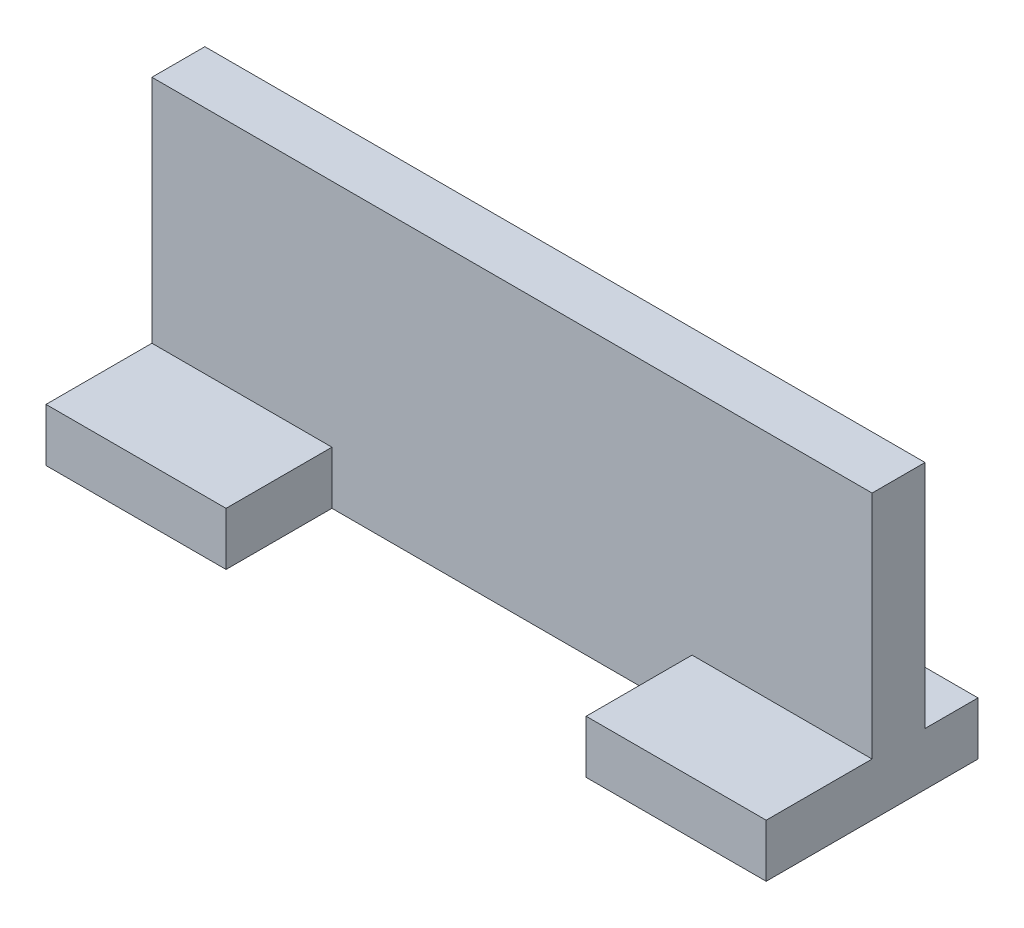
ISO-10303-21;
HEADER;
FILE_DESCRIPTION(('STEP AP214'),'2;1');
FILE_NAME('part.step','',(''),(''),'','','');
FILE_SCHEMA(('AUTOMOTIVE_DESIGN { 1 0 10303 214 1 1 1 1 }'));
ENDSEC;
DATA;
#1=APPLICATION_CONTEXT('core data for automotive mechanical design processes');
#2=APPLICATION_PROTOCOL_DEFINITION('international standard','automotive_design',2000,#1);
#3=PRODUCT_CONTEXT('',#1,'mechanical');
#4=PRODUCT('Part','Part','',(#3));
#5=PRODUCT_RELATED_PRODUCT_CATEGORY('part','',(#4));
#6=PRODUCT_DEFINITION_FORMATION('','',#4);
#7=PRODUCT_DEFINITION_CONTEXT('part definition',#1,'design');
#8=PRODUCT_DEFINITION('design','',#6,#7);
#9=PRODUCT_DEFINITION_SHAPE('','',#8);
#10=(LENGTH_UNIT() NAMED_UNIT(*) SI_UNIT(.MILLI.,.METRE.));
#11=(NAMED_UNIT(*) PLANE_ANGLE_UNIT() SI_UNIT($,.RADIAN.));
#12=(NAMED_UNIT(*) SI_UNIT($,.STERADIAN.) SOLID_ANGLE_UNIT());
#13=UNCERTAINTY_MEASURE_WITH_UNIT(LENGTH_MEASURE(1.E-05),#10,'distance_accuracy_value','');
#14=(GEOMETRIC_REPRESENTATION_CONTEXT(3) GLOBAL_UNCERTAINTY_ASSIGNED_CONTEXT((#13)) GLOBAL_UNIT_ASSIGNED_CONTEXT((#10,
#11,#12)) REPRESENTATION_CONTEXT('',''));
#15=CARTESIAN_POINT('',(0.,0.,0.));
#16=DIRECTION('',(0.,0.,1.));
#17=DIRECTION('',(1.,0.,0.));
#18=AXIS2_PLACEMENT_3D('',#15,#16,#17);
#19=CARTESIAN_POINT('',(0.,0.,10.));
#20=DIRECTION('',(0.,0.,1.));
#21=DIRECTION('',(1.,0.,0.));
#22=AXIS2_PLACEMENT_3D('',#19,#20,#21);
#23=PLANE('',#22);
#24=DIRECTION('',(0.,-1.,0.));
#25=VECTOR('',#24,1.);
#26=CARTESIAN_POINT('',(34.,-26.75,10.));
#27=LINE('',#26,#25);
#28=CARTESIAN_POINT('',(34.,-16.75,10.));
#29=VERTEX_POINT('',#28);
#30=CARTESIAN_POINT('',(34.,-26.75,10.));
#31=VERTEX_POINT('',#30);
#32=EDGE_CURVE('E61',#29,#31,#27,.T.);
#33=ORIENTED_EDGE('',*,*,#32,.F.);
#34=DIRECTION('',(1.,0.,0.));
#35=VECTOR('',#34,1.);
#36=CARTESIAN_POINT('',(34.,-16.75,10.));
#37=LINE('',#36,#35);
#38=CARTESIAN_POINT('',(68.,-16.75,10.));
#39=VERTEX_POINT('',#38);
#40=EDGE_CURVE('E181',#29,#39,#37,.T.);
#41=ORIENTED_EDGE('',*,*,#40,.T.);
#42=DIRECTION('',(0.,1.,0.));
#43=VECTOR('',#42,1.);
#44=CARTESIAN_POINT('',(68.,26.75,10.));
#45=LINE('',#44,#43);
#46=CARTESIAN_POINT('',(68.,26.75,10.));
#47=VERTEX_POINT('',#46);
#48=EDGE_CURVE('E308',#39,#47,#45,.T.);
#49=ORIENTED_EDGE('',*,*,#48,.T.);
#50=DIRECTION('',(-1.,0.,0.));
#51=VECTOR('',#50,1.);
#52=CARTESIAN_POINT('',(-68.,26.75,10.));
#53=LINE('',#52,#51);
#54=CARTESIAN_POINT('',(-68.,26.75,10.));
#55=VERTEX_POINT('',#54);
#56=EDGE_CURVE('E311',#47,#55,#53,.T.);
#57=ORIENTED_EDGE('',*,*,#56,.T.);
#58=DIRECTION('',(0.,-1.,0.));
#59=VECTOR('',#58,1.);
#60=CARTESIAN_POINT('',(-68.,26.75,10.));
#61=LINE('',#60,#59);
#62=CARTESIAN_POINT('',(-68.,-16.75,10.));
#63=VERTEX_POINT('',#62);
#64=EDGE_CURVE('E315',#55,#63,#61,.T.);
#65=ORIENTED_EDGE('',*,*,#64,.T.);
#66=DIRECTION('',(-1.,0.,0.));
#67=VECTOR('',#66,1.);
#68=CARTESIAN_POINT('',(-34.,-16.75,10.));
#69=LINE('',#68,#67);
#70=CARTESIAN_POINT('',(-34.,-16.75,10.));
#71=VERTEX_POINT('',#70);
#72=EDGE_CURVE('E224',#71,#63,#69,.T.);
#73=ORIENTED_EDGE('',*,*,#72,.F.);
#74=DIRECTION('',(0.,-1.,0.));
#75=VECTOR('',#74,1.);
#76=CARTESIAN_POINT('',(-34.,-26.75,10.));
#77=LINE('',#76,#75);
#78=CARTESIAN_POINT('',(-34.,-26.75,10.));
#79=VERTEX_POINT('',#78);
#80=EDGE_CURVE('E247',#71,#79,#77,.T.);
#81=ORIENTED_EDGE('',*,*,#80,.T.);
#82=DIRECTION('',(1.,0.,0.));
#83=VECTOR('',#82,1.);
#84=CARTESIAN_POINT('',(-68.,-26.75,10.));
#85=LINE('',#84,#83);
#86=EDGE_CURVE('E66',#79,#31,#85,.T.);
#87=ORIENTED_EDGE('',*,*,#86,.T.);
#88=EDGE_LOOP('',(#33,#41,#49,#57,#65,#73,#81,#87));
#89=FACE_BOUND('',#88,.T.);
#90=ADVANCED_FACE('F45',(#89),#23,.T.);
#91=CARTESIAN_POINT('',(0.,0.,0.));
#92=DIRECTION('',(0.,0.,1.));
#93=DIRECTION('',(1.,0.,0.));
#94=AXIS2_PLACEMENT_3D('',#91,#92,#93);
#95=PLANE('',#94);
#96=CARTESIAN_POINT('',(-12.5,9.25000000000001,0.));
#97=DIRECTION('',(0.,0.,1.));
#98=DIRECTION('',(1.,0.,0.));
#99=AXIS2_PLACEMENT_3D('',#96,#97,#98);
#100=CIRCLE('',#99,5.);
#101=CARTESIAN_POINT('',(-7.50000000000002,9.25000000000001,0.));
#102=VERTEX_POINT('',#101);
#103=EDGE_CURVE('E54',#102,#102,#100,.F.);
#104=ORIENTED_EDGE('',*,*,#103,.F.);
#105=EDGE_LOOP('',(#104));
#106=FACE_BOUND('',#105,.T.);
#107=CARTESIAN_POINT('',(12.5,9.24999999999983,0.));
#108=DIRECTION('',(0.,0.,1.));
#109=DIRECTION('',(1.,0.,0.));
#110=AXIS2_PLACEMENT_3D('',#107,#108,#109);
#111=CIRCLE('',#110,5.);
#112=CARTESIAN_POINT('',(17.5,9.24999999999983,0.));
#113=VERTEX_POINT('',#112);
#114=EDGE_CURVE('E11',#113,#113,#111,.F.);
#115=ORIENTED_EDGE('',*,*,#114,.F.);
#116=EDGE_LOOP('',(#115));
#117=FACE_BOUND('',#116,.T.);
#118=DIRECTION('',(1.,0.,0.));
#119=VECTOR('',#118,1.);
#120=CARTESIAN_POINT('',(34.,-16.75,0.));
#121=LINE('',#120,#119);
#122=CARTESIAN_POINT('',(34.,-16.75,0.));
#123=VERTEX_POINT('',#122);
#124=CARTESIAN_POINT('',(68.,-16.75,0.));
#125=VERTEX_POINT('',#124);
#126=EDGE_CURVE('E221',#123,#125,#121,.T.);
#127=ORIENTED_EDGE('',*,*,#126,.F.);
#128=DIRECTION('',(0.,1.,0.));
#129=VECTOR('',#128,1.);
#130=CARTESIAN_POINT('',(34.,-26.75,0.));
#131=LINE('',#130,#129);
#132=CARTESIAN_POINT('',(34.,-26.75,0.));
#133=VERTEX_POINT('',#132);
#134=EDGE_CURVE('E201',#133,#123,#131,.T.);
#135=ORIENTED_EDGE('',*,*,#134,.F.);
#136=DIRECTION('',(1.,0.,0.));
#137=VECTOR('',#136,1.);
#138=CARTESIAN_POINT('',(-68.,-26.75,0.));
#139=LINE('',#138,#137);
#140=CARTESIAN_POINT('',(-34.,-26.75,0.));
#141=VERTEX_POINT('',#140);
#142=EDGE_CURVE('E312',#141,#133,#139,.T.);
#143=ORIENTED_EDGE('',*,*,#142,.F.);
#144=DIRECTION('',(0.,1.,0.));
#145=VECTOR('',#144,1.);
#146=CARTESIAN_POINT('',(-34.,-26.75,0.));
#147=LINE('',#146,#145);
#148=CARTESIAN_POINT('',(-34.,-16.75,0.));
#149=VERTEX_POINT('',#148);
#150=EDGE_CURVE('E265',#141,#149,#147,.T.);
#151=ORIENTED_EDGE('',*,*,#150,.T.);
#152=DIRECTION('',(-1.,0.,0.));
#153=VECTOR('',#152,1.);
#154=CARTESIAN_POINT('',(-34.,-16.75,0.));
#155=LINE('',#154,#153);
#156=CARTESIAN_POINT('',(-68.,-16.75,0.));
#157=VERTEX_POINT('',#156);
#158=EDGE_CURVE('E282',#149,#157,#155,.T.);
#159=ORIENTED_EDGE('',*,*,#158,.T.);
#160=DIRECTION('',(0.,-1.,0.));
#161=VECTOR('',#160,1.);
#162=CARTESIAN_POINT('',(-68.,26.75,0.));
#163=LINE('',#162,#161);
#164=CARTESIAN_POINT('',(-68.,26.75,0.));
#165=VERTEX_POINT('',#164);
#166=EDGE_CURVE('E327',#165,#157,#163,.T.);
#167=ORIENTED_EDGE('',*,*,#166,.F.);
#168=DIRECTION('',(-1.,0.,0.));
#169=VECTOR('',#168,1.);
#170=CARTESIAN_POINT('',(-68.,26.75,0.));
#171=LINE('',#170,#169);
#172=CARTESIAN_POINT('',(68.,26.75,0.));
#173=VERTEX_POINT('',#172);
#174=EDGE_CURVE('E324',#173,#165,#171,.T.);
#175=ORIENTED_EDGE('',*,*,#174,.F.);
#176=DIRECTION('',(0.,1.,0.));
#177=VECTOR('',#176,1.);
#178=CARTESIAN_POINT('',(68.,26.75,0.));
#179=LINE('',#178,#177);
#180=EDGE_CURVE('E307',#125,#173,#179,.T.);
#181=ORIENTED_EDGE('',*,*,#180,.F.);
#182=EDGE_LOOP('',(#127,#135,#143,#151,#159,#167,#175,#181));
#183=FACE_BOUND('',#182,.T.);
#184=ADVANCED_FACE('F352',(#106,#117,#183),#95,.F.);
#185=CARTESIAN_POINT('',(68.,26.75,10.));
#186=DIRECTION('',(-1.,0.,0.));
#187=DIRECTION('',(0.,0.,1.));
#188=AXIS2_PLACEMENT_3D('',#185,#186,#187);
#189=PLANE('',#188);
#190=DIRECTION('',(0.,0.,-1.));
#191=VECTOR('',#190,1.);
#192=CARTESIAN_POINT('',(68.,-26.75,10.));
#193=LINE('',#192,#191);
#194=CARTESIAN_POINT('',(68.,-26.75,30.));
#195=VERTEX_POINT('',#194);
#196=CARTESIAN_POINT('',(68.,-26.75,-10.));
#197=VERTEX_POINT('',#196);
#198=EDGE_CURVE('E321',#195,#197,#193,.T.);
#199=ORIENTED_EDGE('',*,*,#198,.T.);
#200=DIRECTION('',(0.,-1.,0.));
#201=VECTOR('',#200,1.);
#202=CARTESIAN_POINT('',(68.,-26.75,-10.));
#203=LINE('',#202,#201);
#204=CARTESIAN_POINT('',(68.,-16.75,-10.));
#205=VERTEX_POINT('',#204);
#206=EDGE_CURVE('E197',#205,#197,#203,.T.);
#207=ORIENTED_EDGE('',*,*,#206,.F.);
#208=DIRECTION('',(0.,0.,-1.));
#209=VECTOR('',#208,1.);
#210=CARTESIAN_POINT('',(68.,-16.75,0.));
#211=LINE('',#210,#209);
#212=EDGE_CURVE('E206',#125,#205,#211,.T.);
#213=ORIENTED_EDGE('',*,*,#212,.F.);
#214=ORIENTED_EDGE('',*,*,#180,.T.);
#215=DIRECTION('',(0.,0.,-1.));
#216=VECTOR('',#215,1.);
#217=CARTESIAN_POINT('',(68.,26.75,10.));
#218=LINE('',#217,#216);
#219=EDGE_CURVE('E343',#47,#173,#218,.T.);
#220=ORIENTED_EDGE('',*,*,#219,.F.);
#221=ORIENTED_EDGE('',*,*,#48,.F.);
#222=DIRECTION('',(0.,0.,-1.));
#223=VECTOR('',#222,1.);
#224=CARTESIAN_POINT('',(68.,-16.75,10.));
#225=LINE('',#224,#223);
#226=CARTESIAN_POINT('',(68.,-16.75,30.));
#227=VERTEX_POINT('',#226);
#228=EDGE_CURVE('E191',#227,#39,#225,.T.);
#229=ORIENTED_EDGE('',*,*,#228,.F.);
#230=DIRECTION('',(0.,1.,0.));
#231=VECTOR('',#230,1.);
#232=CARTESIAN_POINT('',(68.,-26.75,30.));
#233=LINE('',#232,#231);
#234=EDGE_CURVE('E175',#195,#227,#233,.T.);
#235=ORIENTED_EDGE('',*,*,#234,.F.);
#236=EDGE_LOOP('',(#199,#207,#213,#214,#220,#221,#229,#235));
#237=FACE_BOUND('',#236,.T.);
#238=ADVANCED_FACE('F47',(#237),#189,.F.);
#239=CARTESIAN_POINT('',(-68.,26.75,10.));
#240=DIRECTION('',(0.,-1.,0.));
#241=DIRECTION('',(0.,0.,-1.));
#242=AXIS2_PLACEMENT_3D('',#239,#240,#241);
#243=PLANE('',#242);
#244=ORIENTED_EDGE('',*,*,#174,.T.);
#245=DIRECTION('',(0.,0.,-1.));
#246=VECTOR('',#245,1.);
#247=CARTESIAN_POINT('',(-68.,26.75,10.));
#248=LINE('',#247,#246);
#249=EDGE_CURVE('E339',#55,#165,#248,.T.);
#250=ORIENTED_EDGE('',*,*,#249,.F.);
#251=ORIENTED_EDGE('',*,*,#56,.F.);
#252=ORIENTED_EDGE('',*,*,#219,.T.);
#253=EDGE_LOOP('',(#244,#250,#251,#252));
#254=FACE_BOUND('',#253,.T.);
#255=ADVANCED_FACE('F401',(#254),#243,.F.);
#256=CARTESIAN_POINT('',(-68.,26.75,10.));
#257=DIRECTION('',(1.,0.,0.));
#258=DIRECTION('',(0.,1.,0.));
#259=AXIS2_PLACEMENT_3D('',#256,#257,#258);
#260=PLANE('',#259);
#261=ORIENTED_EDGE('',*,*,#166,.T.);
#262=DIRECTION('',(0.,0.,-1.));
#263=VECTOR('',#262,1.);
#264=CARTESIAN_POINT('',(-68.,-16.75,0.));
#265=LINE('',#264,#263);
#266=CARTESIAN_POINT('',(-68.,-16.75,-10.));
#267=VERTEX_POINT('',#266);
#268=EDGE_CURVE('E251',#157,#267,#265,.T.);
#269=ORIENTED_EDGE('',*,*,#268,.T.);
#270=DIRECTION('',(0.,-1.,0.));
#271=VECTOR('',#270,1.);
#272=CARTESIAN_POINT('',(-68.,-26.75,-10.));
#273=LINE('',#272,#271);
#274=CARTESIAN_POINT('',(-68.,-26.75,-10.));
#275=VERTEX_POINT('',#274);
#276=EDGE_CURVE('E270',#267,#275,#273,.T.);
#277=ORIENTED_EDGE('',*,*,#276,.T.);
#278=DIRECTION('',(0.,0.,-1.));
#279=VECTOR('',#278,1.);
#280=CARTESIAN_POINT('',(-68.,-26.75,10.));
#281=LINE('',#280,#279);
#282=CARTESIAN_POINT('',(-68.,-26.75,30.));
#283=VERTEX_POINT('',#282);
#284=EDGE_CURVE('E336',#283,#275,#281,.T.);
#285=ORIENTED_EDGE('',*,*,#284,.F.);
#286=DIRECTION('',(0.,1.,0.));
#287=VECTOR('',#286,1.);
#288=CARTESIAN_POINT('',(-68.,-26.75,30.));
#289=LINE('',#288,#287);
#290=CARTESIAN_POINT('',(-68.,-16.75,30.));
#291=VERTEX_POINT('',#290);
#292=EDGE_CURVE('E246',#283,#291,#289,.T.);
#293=ORIENTED_EDGE('',*,*,#292,.T.);
#294=DIRECTION('',(0.,0.,-1.));
#295=VECTOR('',#294,1.);
#296=CARTESIAN_POINT('',(-68.,-16.75,10.));
#297=LINE('',#296,#295);
#298=EDGE_CURVE('E242',#291,#63,#297,.T.);
#299=ORIENTED_EDGE('',*,*,#298,.T.);
#300=ORIENTED_EDGE('',*,*,#64,.F.);
#301=ORIENTED_EDGE('',*,*,#249,.T.);
#302=EDGE_LOOP('',(#261,#269,#277,#285,#293,#299,#300,#301));
#303=FACE_BOUND('',#302,.T.);
#304=ADVANCED_FACE('F399',(#303),#260,.F.);
#305=CARTESIAN_POINT('',(-68.,-26.75,10.));
#306=DIRECTION('',(0.,1.,0.));
#307=DIRECTION('',(0.,0.,1.));
#308=AXIS2_PLACEMENT_3D('',#305,#306,#307);
#309=PLANE('',#308);
#310=ORIENTED_EDGE('',*,*,#284,.T.);
#311=DIRECTION('',(-1.,0.,0.));
#312=VECTOR('',#311,1.);
#313=CARTESIAN_POINT('',(-34.,-26.75,-10.));
#314=LINE('',#313,#312);
#315=CARTESIAN_POINT('',(-34.,-26.75,-10.));
#316=VERTEX_POINT('',#315);
#317=EDGE_CURVE('E289',#316,#275,#314,.T.);
#318=ORIENTED_EDGE('',*,*,#317,.F.);
#319=DIRECTION('',(0.,0.,1.));
#320=VECTOR('',#319,1.);
#321=CARTESIAN_POINT('',(-34.,-26.75,0.));
#322=LINE('',#321,#320);
#323=EDGE_CURVE('E278',#316,#141,#322,.T.);
#324=ORIENTED_EDGE('',*,*,#323,.T.);
#325=ORIENTED_EDGE('',*,*,#142,.T.);
#326=DIRECTION('',(0.,0.,1.));
#327=VECTOR('',#326,1.);
#328=CARTESIAN_POINT('',(34.,-26.75,0.));
#329=LINE('',#328,#327);
#330=CARTESIAN_POINT('',(34.,-26.75,-10.));
#331=VERTEX_POINT('',#330);
#332=EDGE_CURVE('E205',#331,#133,#329,.T.);
#333=ORIENTED_EDGE('',*,*,#332,.F.);
#334=DIRECTION('',(1.,0.,0.));
#335=VECTOR('',#334,1.);
#336=CARTESIAN_POINT('',(34.,-26.75,-10.));
#337=LINE('',#336,#335);
#338=EDGE_CURVE('E215',#331,#197,#337,.T.);
#339=ORIENTED_EDGE('',*,*,#338,.T.);
#340=ORIENTED_EDGE('',*,*,#198,.F.);
#341=DIRECTION('',(1.,0.,0.));
#342=VECTOR('',#341,1.);
#343=CARTESIAN_POINT('',(34.,-26.75,30.));
#344=LINE('',#343,#342);
#345=CARTESIAN_POINT('',(34.,-26.75,30.));
#346=VERTEX_POINT('',#345);
#347=EDGE_CURVE('E180',#346,#195,#344,.T.);
#348=ORIENTED_EDGE('',*,*,#347,.F.);
#349=DIRECTION('',(0.,0.,1.));
#350=VECTOR('',#349,1.);
#351=CARTESIAN_POINT('',(34.,-26.75,10.));
#352=LINE('',#351,#350);
#353=EDGE_CURVE('E165',#31,#346,#352,.T.);
#354=ORIENTED_EDGE('',*,*,#353,.F.);
#355=ORIENTED_EDGE('',*,*,#86,.F.);
#356=DIRECTION('',(0.,0.,1.));
#357=VECTOR('',#356,1.);
#358=CARTESIAN_POINT('',(-34.,-26.75,10.));
#359=LINE('',#358,#357);
#360=CARTESIAN_POINT('',(-34.,-26.75,30.));
#361=VERTEX_POINT('',#360);
#362=EDGE_CURVE('E259',#79,#361,#359,.T.);
#363=ORIENTED_EDGE('',*,*,#362,.T.);
#364=DIRECTION('',(-1.,0.,0.));
#365=VECTOR('',#364,1.);
#366=CARTESIAN_POINT('',(-34.,-26.75,30.));
#367=LINE('',#366,#365);
#368=EDGE_CURVE('E232',#361,#283,#367,.T.);
#369=ORIENTED_EDGE('',*,*,#368,.T.);
#370=EDGE_LOOP('',(#310,#318,#324,#325,#333,#339,#340,#348,#354,#355,#363,#369));
#371=FACE_BOUND('',#370,.T.);
#372=ADVANCED_FACE('F376',(#371),#309,.F.);
#373=CARTESIAN_POINT('',(-12.5,9.25000000000001,-12.));
#374=DIRECTION('',(0.,0.,1.));
#375=DIRECTION('',(1.,0.,0.));
#376=AXIS2_PLACEMENT_3D('',#373,#374,#375);
#377=CYLINDRICAL_SURFACE('',#376,5.);
#378=CARTESIAN_POINT('',(-12.5,9.25000000000001,-12.));
#379=DIRECTION('',(0.,0.,-1.));
#380=DIRECTION('',(-1.,0.,0.));
#381=AXIS2_PLACEMENT_3D('',#378,#379,#380);
#382=CIRCLE('',#381,5.);
#383=CARTESIAN_POINT('',(-17.5,9.25000000000001,-12.));
#384=VERTEX_POINT('',#383);
#385=EDGE_CURVE('E303',#384,#384,#382,.T.);
#386=ORIENTED_EDGE('',*,*,#385,.F.);
#387=EDGE_LOOP('',(#386));
#388=FACE_BOUND('',#387,.T.);
#389=ORIENTED_EDGE('',*,*,#103,.T.);
#390=EDGE_LOOP('',(#389));
#391=FACE_BOUND('',#390,.T.);
#392=ADVANCED_FACE('F350',(#388,#391),#377,.T.);
#393=CARTESIAN_POINT('',(-12.5,9.25000000000001,-12.));
#394=DIRECTION('',(0.,0.,-1.));
#395=DIRECTION('',(-1.,0.,0.));
#396=AXIS2_PLACEMENT_3D('',#393,#394,#395);
#397=PLANE('',#396);
#398=ORIENTED_EDGE('',*,*,#385,.T.);
#399=EDGE_LOOP('',(#398));
#400=FACE_BOUND('',#399,.T.);
#401=ADVANCED_FACE('F452',(#400),#397,.T.);
#402=CARTESIAN_POINT('',(12.5,9.24999999999983,-12.));
#403=DIRECTION('',(0.,0.,1.));
#404=DIRECTION('',(1.,0.,0.));
#405=AXIS2_PLACEMENT_3D('',#402,#403,#404);
#406=CYLINDRICAL_SURFACE('',#405,5.);
#407=CARTESIAN_POINT('',(12.5,9.24999999999983,-12.));
#408=DIRECTION('',(0.,0.,-1.));
#409=DIRECTION('',(-1.,0.,0.));
#410=AXIS2_PLACEMENT_3D('',#407,#408,#409);
#411=CIRCLE('',#410,5.);
#412=CARTESIAN_POINT('',(7.49999999999999,9.24999999999983,-12.));
#413=VERTEX_POINT('',#412);
#414=EDGE_CURVE('E293',#413,#413,#411,.T.);
#415=ORIENTED_EDGE('',*,*,#414,.F.);
#416=EDGE_LOOP('',(#415));
#417=FACE_BOUND('',#416,.T.);
#418=ORIENTED_EDGE('',*,*,#114,.T.);
#419=EDGE_LOOP('',(#418));
#420=FACE_BOUND('',#419,.T.);
#421=ADVANCED_FACE('F449',(#417,#420),#406,.T.);
#422=CARTESIAN_POINT('',(12.5,9.24999999999983,-12.));
#423=DIRECTION('',(0.,0.,-1.));
#424=DIRECTION('',(-1.,0.,0.));
#425=AXIS2_PLACEMENT_3D('',#422,#423,#424);
#426=PLANE('',#425);
#427=ORIENTED_EDGE('',*,*,#414,.T.);
#428=EDGE_LOOP('',(#427));
#429=FACE_BOUND('',#428,.T.);
#430=ADVANCED_FACE('F446',(#429),#426,.T.);
#431=CARTESIAN_POINT('',(-34.,-26.75,-10.));
#432=DIRECTION('',(0.,0.,-1.));
#433=DIRECTION('',(-1.,0.,0.));
#434=AXIS2_PLACEMENT_3D('',#431,#432,#433);
#435=PLANE('',#434);
#436=ORIENTED_EDGE('',*,*,#276,.F.);
#437=DIRECTION('',(-1.,0.,0.));
#438=VECTOR('',#437,1.);
#439=CARTESIAN_POINT('',(-34.,-16.75,-10.));
#440=LINE('',#439,#438);
#441=CARTESIAN_POINT('',(-34.,-16.75,-10.));
#442=VERTEX_POINT('',#441);
#443=EDGE_CURVE('E294',#442,#267,#440,.T.);
#444=ORIENTED_EDGE('',*,*,#443,.F.);
#445=DIRECTION('',(0.,-1.,0.));
#446=VECTOR('',#445,1.);
#447=CARTESIAN_POINT('',(-34.,-26.75,-10.));
#448=LINE('',#447,#446);
#449=EDGE_CURVE('E274',#442,#316,#448,.T.);
#450=ORIENTED_EDGE('',*,*,#449,.T.);
#451=ORIENTED_EDGE('',*,*,#317,.T.);
#452=EDGE_LOOP('',(#436,#444,#450,#451));
#453=FACE_BOUND('',#452,.T.);
#454=ADVANCED_FACE('F422',(#453),#435,.T.);
#455=CARTESIAN_POINT('',(-34.,-16.75,0.));
#456=DIRECTION('',(0.,1.,0.));
#457=DIRECTION('',(-1.,0.,0.));
#458=AXIS2_PLACEMENT_3D('',#455,#456,#457);
#459=PLANE('',#458);
#460=ORIENTED_EDGE('',*,*,#268,.F.);
#461=ORIENTED_EDGE('',*,*,#158,.F.);
#462=DIRECTION('',(0.,0.,-1.));
#463=VECTOR('',#462,1.);
#464=CARTESIAN_POINT('',(-34.,-16.75,0.));
#465=LINE('',#464,#463);
#466=EDGE_CURVE('E269',#149,#442,#465,.T.);
#467=ORIENTED_EDGE('',*,*,#466,.T.);
#468=ORIENTED_EDGE('',*,*,#443,.T.);
#469=EDGE_LOOP('',(#460,#461,#467,#468));
#470=FACE_BOUND('',#469,.T.);
#471=ADVANCED_FACE('F415',(#470),#459,.T.);
#472=CARTESIAN_POINT('',(-34.,0.,0.));
#473=DIRECTION('',(-1.,0.,0.));
#474=DIRECTION('',(0.,-1.,0.));
#475=AXIS2_PLACEMENT_3D('',#472,#473,#474);
#476=PLANE('',#475);
#477=ORIENTED_EDGE('',*,*,#150,.F.);
#478=ORIENTED_EDGE('',*,*,#323,.F.);
#479=ORIENTED_EDGE('',*,*,#449,.F.);
#480=ORIENTED_EDGE('',*,*,#466,.F.);
#481=EDGE_LOOP('',(#477,#478,#479,#480));
#482=FACE_BOUND('',#481,.T.);
#483=ADVANCED_FACE('F418',(#482),#476,.F.);
#484=CARTESIAN_POINT('',(-34.,-16.75,10.));
#485=DIRECTION('',(0.,1.,0.));
#486=DIRECTION('',(-1.,0.,0.));
#487=AXIS2_PLACEMENT_3D('',#484,#485,#486);
#488=PLANE('',#487);
#489=ORIENTED_EDGE('',*,*,#298,.F.);
#490=DIRECTION('',(-1.,0.,0.));
#491=VECTOR('',#490,1.);
#492=CARTESIAN_POINT('',(-34.,-16.75,30.));
#493=LINE('',#492,#491);
#494=CARTESIAN_POINT('',(-34.,-16.75,30.));
#495=VERTEX_POINT('',#494);
#496=EDGE_CURVE('E237',#495,#291,#493,.T.);
#497=ORIENTED_EDGE('',*,*,#496,.F.);
#498=DIRECTION('',(0.,0.,-1.));
#499=VECTOR('',#498,1.);
#500=CARTESIAN_POINT('',(-34.,-16.75,10.));
#501=LINE('',#500,#499);
#502=EDGE_CURVE('E236',#495,#71,#501,.T.);
#503=ORIENTED_EDGE('',*,*,#502,.T.);
#504=ORIENTED_EDGE('',*,*,#72,.T.);
#505=EDGE_LOOP('',(#489,#497,#503,#504));
#506=FACE_BOUND('',#505,.T.);
#507=ADVANCED_FACE('F430',(#506),#488,.T.);
#508=CARTESIAN_POINT('',(-34.,-26.75,30.));
#509=DIRECTION('',(0.,0.,1.));
#510=DIRECTION('',(1.,0.,0.));
#511=AXIS2_PLACEMENT_3D('',#508,#509,#510);
#512=PLANE('',#511);
#513=ORIENTED_EDGE('',*,*,#292,.F.);
#514=ORIENTED_EDGE('',*,*,#368,.F.);
#515=DIRECTION('',(0.,1.,0.));
#516=VECTOR('',#515,1.);
#517=CARTESIAN_POINT('',(-34.,-26.75,30.));
#518=LINE('',#517,#516);
#519=EDGE_CURVE('E255',#361,#495,#518,.T.);
#520=ORIENTED_EDGE('',*,*,#519,.T.);
#521=ORIENTED_EDGE('',*,*,#496,.T.);
#522=EDGE_LOOP('',(#513,#514,#520,#521));
#523=FACE_BOUND('',#522,.T.);
#524=ADVANCED_FACE('F427',(#523),#512,.T.);
#525=CARTESIAN_POINT('',(-34.,0.,0.));
#526=DIRECTION('',(1.,0.,0.));
#527=DIRECTION('',(0.,1.,0.));
#528=AXIS2_PLACEMENT_3D('',#525,#526,#527);
#529=PLANE('',#528);
#530=ORIENTED_EDGE('',*,*,#80,.F.);
#531=ORIENTED_EDGE('',*,*,#502,.F.);
#532=ORIENTED_EDGE('',*,*,#519,.F.);
#533=ORIENTED_EDGE('',*,*,#362,.F.);
#534=EDGE_LOOP('',(#530,#531,#532,#533));
#535=FACE_BOUND('',#534,.T.);
#536=ADVANCED_FACE('F433',(#535),#529,.T.);
#537=CARTESIAN_POINT('',(34.,-16.75,0.));
#538=DIRECTION('',(0.,-1.,0.));
#539=DIRECTION('',(0.,0.,-1.));
#540=AXIS2_PLACEMENT_3D('',#537,#538,#539);
#541=PLANE('',#540);
#542=ORIENTED_EDGE('',*,*,#212,.T.);
#543=DIRECTION('',(1.,0.,0.));
#544=VECTOR('',#543,1.);
#545=CARTESIAN_POINT('',(34.,-16.75,-10.));
#546=LINE('',#545,#544);
#547=CARTESIAN_POINT('',(34.,-16.75,-10.));
#548=VERTEX_POINT('',#547);
#549=EDGE_CURVE('E225',#548,#205,#546,.T.);
#550=ORIENTED_EDGE('',*,*,#549,.F.);
#551=DIRECTION('',(0.,0.,-1.));
#552=VECTOR('',#551,1.);
#553=CARTESIAN_POINT('',(34.,-16.75,0.));
#554=LINE('',#553,#552);
#555=EDGE_CURVE('E212',#123,#548,#554,.T.);
#556=ORIENTED_EDGE('',*,*,#555,.F.);
#557=ORIENTED_EDGE('',*,*,#126,.T.);
#558=EDGE_LOOP('',(#542,#550,#556,#557));
#559=FACE_BOUND('',#558,.T.);
#560=ADVANCED_FACE('F365',(#559),#541,.F.);
#561=CARTESIAN_POINT('',(34.,-26.75,-10.));
#562=DIRECTION('',(0.,0.,1.));
#563=DIRECTION('',(1.,0.,0.));
#564=AXIS2_PLACEMENT_3D('',#561,#562,#563);
#565=PLANE('',#564);
#566=ORIENTED_EDGE('',*,*,#206,.T.);
#567=ORIENTED_EDGE('',*,*,#338,.F.);
#568=DIRECTION('',(0.,-1.,0.));
#569=VECTOR('',#568,1.);
#570=CARTESIAN_POINT('',(34.,-26.75,-10.));
#571=LINE('',#570,#569);
#572=EDGE_CURVE('E209',#548,#331,#571,.T.);
#573=ORIENTED_EDGE('',*,*,#572,.F.);
#574=ORIENTED_EDGE('',*,*,#549,.T.);
#575=EDGE_LOOP('',(#566,#567,#573,#574));
#576=FACE_BOUND('',#575,.T.);
#577=ADVANCED_FACE('F372',(#576),#565,.F.);
#578=CARTESIAN_POINT('',(34.,0.,0.));
#579=DIRECTION('',(1.,0.,0.));
#580=DIRECTION('',(0.,-1.,0.));
#581=AXIS2_PLACEMENT_3D('',#578,#579,#580);
#582=PLANE('',#581);
#583=ORIENTED_EDGE('',*,*,#134,.T.);
#584=ORIENTED_EDGE('',*,*,#555,.T.);
#585=ORIENTED_EDGE('',*,*,#572,.T.);
#586=ORIENTED_EDGE('',*,*,#332,.T.);
#587=EDGE_LOOP('',(#583,#584,#585,#586));
#588=FACE_BOUND('',#587,.T.);
#589=ADVANCED_FACE('F378',(#588),#582,.F.);
#590=CARTESIAN_POINT('',(34.,-26.75,30.));
#591=DIRECTION('',(0.,0.,-1.));
#592=DIRECTION('',(-1.,0.,0.));
#593=AXIS2_PLACEMENT_3D('',#590,#591,#592);
#594=PLANE('',#593);
#595=ORIENTED_EDGE('',*,*,#234,.T.);
#596=DIRECTION('',(1.,0.,0.));
#597=VECTOR('',#596,1.);
#598=CARTESIAN_POINT('',(34.,-16.75,30.));
#599=LINE('',#598,#597);
#600=CARTESIAN_POINT('',(34.,-16.75,30.));
#601=VERTEX_POINT('',#600);
#602=EDGE_CURVE('E172',#601,#227,#599,.T.);
#603=ORIENTED_EDGE('',*,*,#602,.F.);
#604=DIRECTION('',(0.,1.,0.));
#605=VECTOR('',#604,1.);
#606=CARTESIAN_POINT('',(34.,-26.75,30.));
#607=LINE('',#606,#605);
#608=EDGE_CURVE('E159',#346,#601,#607,.T.);
#609=ORIENTED_EDGE('',*,*,#608,.F.);
#610=ORIENTED_EDGE('',*,*,#347,.T.);
#611=EDGE_LOOP('',(#595,#603,#609,#610));
#612=FACE_BOUND('',#611,.T.);
#613=ADVANCED_FACE('F173',(#612),#594,.F.);
#614=CARTESIAN_POINT('',(34.,-16.75,10.));
#615=DIRECTION('',(0.,-1.,0.));
#616=DIRECTION('',(0.,0.,-1.));
#617=AXIS2_PLACEMENT_3D('',#614,#615,#616);
#618=PLANE('',#617);
#619=ORIENTED_EDGE('',*,*,#228,.T.);
#620=ORIENTED_EDGE('',*,*,#40,.F.);
#621=DIRECTION('',(0.,0.,-1.));
#622=VECTOR('',#621,1.);
#623=CARTESIAN_POINT('',(34.,-16.75,10.));
#624=LINE('',#623,#622);
#625=EDGE_CURVE('E163',#601,#29,#624,.T.);
#626=ORIENTED_EDGE('',*,*,#625,.F.);
#627=ORIENTED_EDGE('',*,*,#602,.T.);
#628=EDGE_LOOP('',(#619,#620,#626,#627));
#629=FACE_BOUND('',#628,.T.);
#630=ADVANCED_FACE('F183',(#629),#618,.F.);
#631=CARTESIAN_POINT('',(34.,0.,0.));
#632=DIRECTION('',(-1.,0.,0.));
#633=DIRECTION('',(0.,1.,0.));
#634=AXIS2_PLACEMENT_3D('',#631,#632,#633);
#635=PLANE('',#634);
#636=ORIENTED_EDGE('',*,*,#32,.T.);
#637=ORIENTED_EDGE('',*,*,#353,.T.);
#638=ORIENTED_EDGE('',*,*,#608,.T.);
#639=ORIENTED_EDGE('',*,*,#625,.T.);
#640=EDGE_LOOP('',(#636,#637,#638,#639));
#641=FACE_BOUND('',#640,.T.);
#642=ADVANCED_FACE('F161',(#641),#635,.T.);
#643=CLOSED_SHELL('',(#90,#184,#238,#255,#304,#372,#392,#401,#421,#430,#454,#471,#483,#507,#524,
#536,#560,#577,#589,#613,#630,#642));
#644=MANIFOLD_SOLID_BREP('B2',#643);
#645=ADVANCED_BREP_SHAPE_REPRESENTATION('',(#18,#644),#14);
#646=SHAPE_DEFINITION_REPRESENTATION(#9,#645);
ENDSEC;
END-ISO-10303-21;
